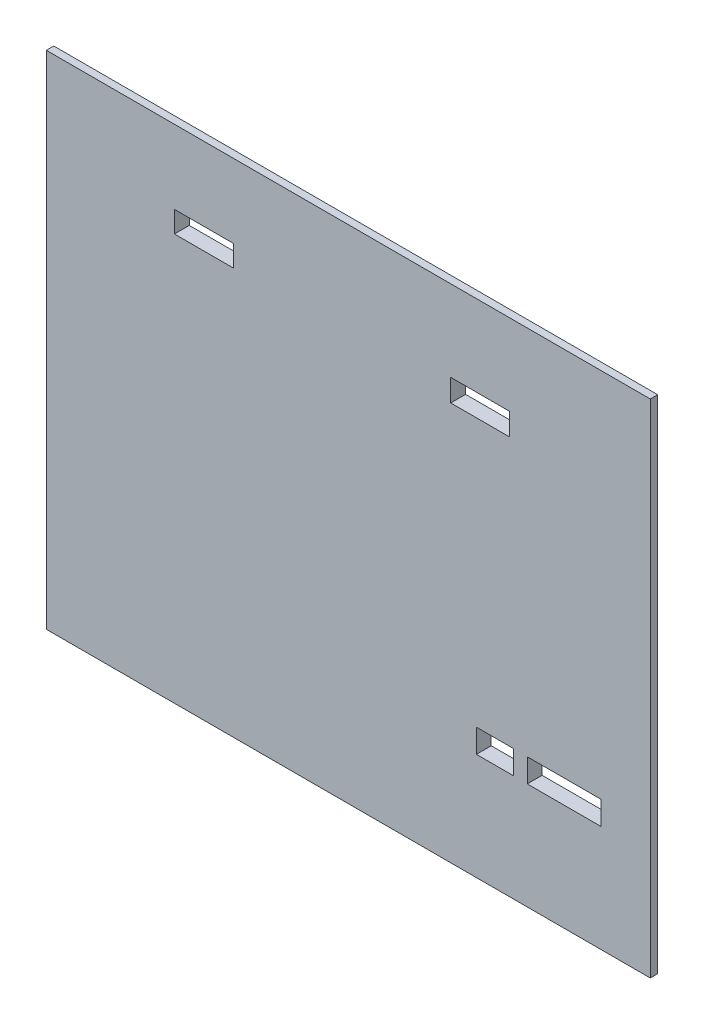
ISO-10303-21;
HEADER;
FILE_DESCRIPTION(('STEP AP214'),'2;1');
FILE_NAME('part.step','',(''),(''),'','','');
FILE_SCHEMA(('AUTOMOTIVE_DESIGN { 1 0 10303 214 1 1 1 1 }'));
ENDSEC;
DATA;
#1=APPLICATION_CONTEXT('core data for automotive mechanical design processes');
#2=APPLICATION_PROTOCOL_DEFINITION('international standard','automotive_design',2000,#1);
#3=PRODUCT_CONTEXT('',#1,'mechanical');
#4=PRODUCT('Part','Part','',(#3));
#5=PRODUCT_RELATED_PRODUCT_CATEGORY('part','',(#4));
#6=PRODUCT_DEFINITION_FORMATION('','',#4);
#7=PRODUCT_DEFINITION_CONTEXT('part definition',#1,'design');
#8=PRODUCT_DEFINITION('design','',#6,#7);
#9=PRODUCT_DEFINITION_SHAPE('','',#8);
#10=(LENGTH_UNIT() NAMED_UNIT(*) SI_UNIT(.MILLI.,.METRE.));
#11=(NAMED_UNIT(*) PLANE_ANGLE_UNIT() SI_UNIT($,.RADIAN.));
#12=(NAMED_UNIT(*) SI_UNIT($,.STERADIAN.) SOLID_ANGLE_UNIT());
#13=UNCERTAINTY_MEASURE_WITH_UNIT(LENGTH_MEASURE(1.E-05),#10,'distance_accuracy_value','');
#14=(GEOMETRIC_REPRESENTATION_CONTEXT(3) GLOBAL_UNCERTAINTY_ASSIGNED_CONTEXT((#13)) GLOBAL_UNIT_ASSIGNED_CONTEXT((#10,
#11,#12)) REPRESENTATION_CONTEXT('',''));
#15=CARTESIAN_POINT('',(0.,0.,0.));
#16=DIRECTION('',(0.,0.,1.));
#17=DIRECTION('',(1.,0.,0.));
#18=AXIS2_PLACEMENT_3D('',#15,#16,#17);
#19=CARTESIAN_POINT('',(190.5,-31.5,3.));
#20=DIRECTION('',(-1.,0.,0.));
#21=DIRECTION('',(0.,0.,1.));
#22=AXIS2_PLACEMENT_3D('',#19,#20,#21);
#23=PLANE('',#22);
#24=DIRECTION('',(0.,-1.,0.));
#25=VECTOR('',#24,1.);
#26=CARTESIAN_POINT('',(190.5,-132.8,1.5));
#27=LINE('',#26,#25);
#28=CARTESIAN_POINT('',(190.5,-31.5,1.5));
#29=VERTEX_POINT('',#28);
#30=CARTESIAN_POINT('',(190.5,-132.8,1.5));
#31=VERTEX_POINT('',#30);
#32=EDGE_CURVE('E349',#29,#31,#27,.T.);
#33=ORIENTED_EDGE('',*,*,#32,.F.);
#34=DIRECTION('',(0.,0.,-1.));
#35=VECTOR('',#34,1.);
#36=CARTESIAN_POINT('',(190.5,-31.5,3.));
#37=LINE('',#36,#35);
#38=CARTESIAN_POINT('',(190.5,-31.5,3.));
#39=VERTEX_POINT('',#38);
#40=EDGE_CURVE('E391',#39,#29,#37,.T.);
#41=ORIENTED_EDGE('',*,*,#40,.F.);
#42=DIRECTION('',(0.,1.,0.));
#43=VECTOR('',#42,1.);
#44=CARTESIAN_POINT('',(190.5,-31.5,3.));
#45=LINE('',#44,#43);
#46=CARTESIAN_POINT('',(190.5,-132.8,3.));
#47=VERTEX_POINT('',#46);
#48=EDGE_CURVE('E366',#47,#39,#45,.T.);
#49=ORIENTED_EDGE('',*,*,#48,.F.);
#50=DIRECTION('',(0.,0.,-1.));
#51=VECTOR('',#50,1.);
#52=CARTESIAN_POINT('',(190.5,-132.8,3.));
#53=LINE('',#52,#51);
#54=EDGE_CURVE('E379',#47,#31,#53,.T.);
#55=ORIENTED_EDGE('',*,*,#54,.T.);
#56=EDGE_LOOP('',(#33,#41,#49,#55));
#57=FACE_BOUND('',#56,.T.);
#58=ADVANCED_FACE('F43',(#57),#23,.F.);
#59=CARTESIAN_POINT('',(190.5,-31.5,3.));
#60=DIRECTION('',(0.,-1.,0.));
#61=DIRECTION('',(0.,0.,-1.));
#62=AXIS2_PLACEMENT_3D('',#59,#60,#61);
#63=PLANE('',#62);
#64=ORIENTED_EDGE('',*,*,#40,.T.);
#65=DIRECTION('',(1.,0.,0.));
#66=VECTOR('',#65,1.);
#67=CARTESIAN_POINT('',(67.5,-31.5,1.5));
#68=LINE('',#67,#66);
#69=CARTESIAN_POINT('',(68.5,-31.5,1.5));
#70=VERTEX_POINT('',#69);
#71=EDGE_CURVE('E344',#70,#29,#68,.T.);
#72=ORIENTED_EDGE('',*,*,#71,.F.);
#73=DIRECTION('',(0.,0.,-1.));
#74=VECTOR('',#73,1.);
#75=CARTESIAN_POINT('',(68.5,-31.5,3.));
#76=LINE('',#75,#74);
#77=CARTESIAN_POINT('',(68.5,-31.5,3.));
#78=VERTEX_POINT('',#77);
#79=EDGE_CURVE('E387',#78,#70,#76,.T.);
#80=ORIENTED_EDGE('',*,*,#79,.F.);
#81=DIRECTION('',(-1.,0.,0.));
#82=VECTOR('',#81,1.);
#83=CARTESIAN_POINT('',(190.5,-31.5,3.));
#84=LINE('',#83,#82);
#85=EDGE_CURVE('E370',#39,#78,#84,.T.);
#86=ORIENTED_EDGE('',*,*,#85,.F.);
#87=EDGE_LOOP('',(#64,#72,#80,#86));
#88=FACE_BOUND('',#87,.T.);
#89=ADVANCED_FACE('F478',(#88),#63,.F.);
#90=CARTESIAN_POINT('',(68.5,-31.5,3.));
#91=DIRECTION('',(1.,0.,0.));
#92=DIRECTION('',(0.,0.,-1.));
#93=AXIS2_PLACEMENT_3D('',#90,#91,#92);
#94=PLANE('',#93);
#95=ORIENTED_EDGE('',*,*,#79,.T.);
#96=DIRECTION('',(0.,-1.,0.));
#97=VECTOR('',#96,1.);
#98=CARTESIAN_POINT('',(68.5,-31.5,1.5));
#99=LINE('',#98,#97);
#100=CARTESIAN_POINT('',(68.5,-132.8,1.5));
#101=VERTEX_POINT('',#100);
#102=EDGE_CURVE('E359',#70,#101,#99,.T.);
#103=ORIENTED_EDGE('',*,*,#102,.T.);
#104=DIRECTION('',(0.,0.,-1.));
#105=VECTOR('',#104,1.);
#106=CARTESIAN_POINT('',(68.5,-132.8,3.));
#107=LINE('',#106,#105);
#108=CARTESIAN_POINT('',(68.5,-132.8,3.));
#109=VERTEX_POINT('',#108);
#110=EDGE_CURVE('E383',#109,#101,#107,.T.);
#111=ORIENTED_EDGE('',*,*,#110,.F.);
#112=DIRECTION('',(0.,-1.,0.));
#113=VECTOR('',#112,1.);
#114=CARTESIAN_POINT('',(68.5,-31.5,3.));
#115=LINE('',#114,#113);
#116=EDGE_CURVE('E373',#78,#109,#115,.T.);
#117=ORIENTED_EDGE('',*,*,#116,.F.);
#118=EDGE_LOOP('',(#95,#103,#111,#117));
#119=FACE_BOUND('',#118,.T.);
#120=ADVANCED_FACE('F483',(#119),#94,.F.);
#121=CARTESIAN_POINT('',(190.5,-132.8,3.));
#122=DIRECTION('',(0.,1.,0.));
#123=DIRECTION('',(0.,0.,1.));
#124=AXIS2_PLACEMENT_3D('',#121,#122,#123);
#125=PLANE('',#124);
#126=ORIENTED_EDGE('',*,*,#110,.T.);
#127=DIRECTION('',(1.,0.,0.));
#128=VECTOR('',#127,1.);
#129=CARTESIAN_POINT('',(60.5,-132.8,1.5));
#130=LINE('',#129,#128);
#131=EDGE_CURVE('E356',#101,#31,#130,.T.);
#132=ORIENTED_EDGE('',*,*,#131,.T.);
#133=ORIENTED_EDGE('',*,*,#54,.F.);
#134=DIRECTION('',(1.,0.,0.));
#135=VECTOR('',#134,1.);
#136=CARTESIAN_POINT('',(190.5,-132.8,3.));
#137=LINE('',#136,#135);
#138=EDGE_CURVE('E376',#109,#47,#137,.T.);
#139=ORIENTED_EDGE('',*,*,#138,.F.);
#140=EDGE_LOOP('',(#126,#132,#133,#139));
#141=FACE_BOUND('',#140,.T.);
#142=ADVANCED_FACE('F497',(#141),#125,.F.);
#143=CARTESIAN_POINT('',(0.,0.,3.));
#144=DIRECTION('',(0.,0.,-1.));
#145=DIRECTION('',(-1.,0.,0.));
#146=AXIS2_PLACEMENT_3D('',#143,#144,#145);
#147=PLANE('',#146);
#148=DIRECTION('',(1.,0.,0.));
#149=VECTOR('',#148,1.);
#150=CARTESIAN_POINT('',(165.654429089773,-111.265808016146,3.));
#151=LINE('',#150,#149);
#152=CARTESIAN_POINT('',(165.654429089773,-111.265808016146,3.));
#153=VERTEX_POINT('',#152);
#154=CARTESIAN_POINT('',(180.593826855843,-111.265808016146,3.));
#155=VERTEX_POINT('',#154);
#156=EDGE_CURVE('E216',#153,#155,#151,.T.);
#157=ORIENTED_EDGE('',*,*,#156,.F.);
#158=DIRECTION('',(0.,-1.,0.));
#159=VECTOR('',#158,1.);
#160=CARTESIAN_POINT('',(165.654429089773,-106.512363272397,3.));
#161=LINE('',#160,#159);
#162=CARTESIAN_POINT('',(165.654429089773,-106.512363272397,3.));
#163=VERTEX_POINT('',#162);
#164=EDGE_CURVE('E58',#163,#153,#161,.T.);
#165=ORIENTED_EDGE('',*,*,#164,.F.);
#166=DIRECTION('',(-1.,0.,0.));
#167=VECTOR('',#166,1.);
#168=CARTESIAN_POINT('',(165.654429089773,-106.512363272397,3.));
#169=LINE('',#168,#167);
#170=CARTESIAN_POINT('',(180.593826855843,-106.512363272397,3.));
#171=VERTEX_POINT('',#170);
#172=EDGE_CURVE('E224',#171,#163,#169,.T.);
#173=ORIENTED_EDGE('',*,*,#172,.F.);
#174=DIRECTION('',(0.,1.,0.));
#175=VECTOR('',#174,1.);
#176=CARTESIAN_POINT('',(180.593826855843,-106.512363272397,3.));
#177=LINE('',#176,#175);
#178=EDGE_CURVE('E206',#155,#171,#177,.T.);
#179=ORIENTED_EDGE('',*,*,#178,.F.);
#180=EDGE_LOOP('',(#157,#165,#173,#179));
#181=FACE_BOUND('',#180,.T.);
#182=DIRECTION('',(1.,0.,0.));
#183=VECTOR('',#182,1.);
#184=CARTESIAN_POINT('',(94.3773585909965,-50.7000848894199,3.));
#185=LINE('',#184,#183);
#186=CARTESIAN_POINT('',(94.3773585909965,-50.7000848894199,3.));
#187=VERTEX_POINT('',#186);
#188=CARTESIAN_POINT('',(106.288680200082,-50.7000848894199,3.));
#189=VERTEX_POINT('',#188);
#190=EDGE_CURVE('E241',#187,#189,#185,.T.);
#191=ORIENTED_EDGE('',*,*,#190,.F.);
#192=DIRECTION('',(0.,-1.,0.));
#193=VECTOR('',#192,1.);
#194=CARTESIAN_POINT('',(94.3773585909965,-46.3919767184143,3.));
#195=LINE('',#194,#193);
#196=CARTESIAN_POINT('',(94.3773585909965,-46.3919767184143,3.));
#197=VERTEX_POINT('',#196);
#198=EDGE_CURVE('E234',#197,#187,#195,.T.);
#199=ORIENTED_EDGE('',*,*,#198,.F.);
#200=DIRECTION('',(-1.,0.,0.));
#201=VECTOR('',#200,1.);
#202=CARTESIAN_POINT('',(94.3773585909965,-46.3919767184143,3.));
#203=LINE('',#202,#201);
#204=CARTESIAN_POINT('',(106.288680200082,-46.3919767184143,3.));
#205=VERTEX_POINT('',#204);
#206=EDGE_CURVE('E249',#205,#197,#203,.T.);
#207=ORIENTED_EDGE('',*,*,#206,.F.);
#208=DIRECTION('',(0.,1.,0.));
#209=VECTOR('',#208,1.);
#210=CARTESIAN_POINT('',(106.288680200082,-46.3919767184143,3.));
#211=LINE('',#210,#209);
#212=EDGE_CURVE('E245',#189,#205,#211,.T.);
#213=ORIENTED_EDGE('',*,*,#212,.F.);
#214=EDGE_LOOP('',(#191,#199,#207,#213));
#215=FACE_BOUND('',#214,.T.);
#216=DIRECTION('',(1.,0.,0.));
#217=VECTOR('',#216,1.);
#218=CARTESIAN_POINT('',(150.194380870783,-52.3497327217222,3.));
#219=LINE('',#218,#217);
#220=CARTESIAN_POINT('',(150.194380870783,-52.3497327217222,3.));
#221=VERTEX_POINT('',#220);
#222=CARTESIAN_POINT('',(162.0433402349,-52.3497327217222,3.));
#223=VERTEX_POINT('',#222);
#224=EDGE_CURVE('E269',#221,#223,#219,.T.);
#225=ORIENTED_EDGE('',*,*,#224,.F.);
#226=DIRECTION('',(0.,-1.,0.));
#227=VECTOR('',#226,1.);
#228=CARTESIAN_POINT('',(150.194380870783,-47.8734591841669,3.));
#229=LINE('',#228,#227);
#230=CARTESIAN_POINT('',(150.194380870783,-47.8734591841669,3.));
#231=VERTEX_POINT('',#230);
#232=EDGE_CURVE('E257',#231,#221,#229,.T.);
#233=ORIENTED_EDGE('',*,*,#232,.F.);
#234=DIRECTION('',(-1.,0.,0.));
#235=VECTOR('',#234,1.);
#236=CARTESIAN_POINT('',(150.194380870783,-47.8734591841669,3.));
#237=LINE('',#236,#235);
#238=CARTESIAN_POINT('',(162.0433402349,-47.8734591841669,3.));
#239=VERTEX_POINT('',#238);
#240=EDGE_CURVE('E277',#239,#231,#237,.T.);
#241=ORIENTED_EDGE('',*,*,#240,.F.);
#242=DIRECTION('',(0.,1.,0.));
#243=VECTOR('',#242,1.);
#244=CARTESIAN_POINT('',(162.0433402349,-47.8734591841669,3.));
#245=LINE('',#244,#243);
#246=EDGE_CURVE('E273',#223,#239,#245,.T.);
#247=ORIENTED_EDGE('',*,*,#246,.F.);
#248=EDGE_LOOP('',(#225,#233,#241,#247));
#249=FACE_BOUND('',#248,.T.);
#250=DIRECTION('',(-1.,0.,0.));
#251=VECTOR('',#250,1.);
#252=CARTESIAN_POINT('',(162.875,-106.474249894409,3.));
#253=LINE('',#252,#251);
#254=CARTESIAN_POINT('',(162.875,-106.474249894409,3.));
#255=VERTEX_POINT('',#254);
#256=CARTESIAN_POINT('',(155.377227812848,-106.474249894409,3.));
#257=VERTEX_POINT('',#256);
#258=EDGE_CURVE('E297',#255,#257,#253,.T.);
#259=ORIENTED_EDGE('',*,*,#258,.F.);
#260=DIRECTION('',(0.,1.,0.));
#261=VECTOR('',#260,1.);
#262=CARTESIAN_POINT('',(162.875,-111.233730758469,3.));
#263=LINE('',#262,#261);
#264=CARTESIAN_POINT('',(162.875,-111.233730758469,3.));
#265=VERTEX_POINT('',#264);
#266=EDGE_CURVE('E285',#265,#255,#263,.T.);
#267=ORIENTED_EDGE('',*,*,#266,.F.);
#268=DIRECTION('',(1.,0.,0.));
#269=VECTOR('',#268,1.);
#270=CARTESIAN_POINT('',(162.875,-111.233730758469,3.));
#271=LINE('',#270,#269);
#272=CARTESIAN_POINT('',(155.377227812848,-111.233730758469,3.));
#273=VERTEX_POINT('',#272);
#274=EDGE_CURVE('E305',#273,#265,#271,.T.);
#275=ORIENTED_EDGE('',*,*,#274,.F.);
#276=DIRECTION('',(0.,-1.,0.));
#277=VECTOR('',#276,1.);
#278=CARTESIAN_POINT('',(155.377227812848,-111.233730758469,3.));
#279=LINE('',#278,#277);
#280=EDGE_CURVE('E301',#257,#273,#279,.T.);
#281=ORIENTED_EDGE('',*,*,#280,.F.);
#282=EDGE_LOOP('',(#259,#267,#275,#281));
#283=FACE_BOUND('',#282,.T.);
#284=ORIENTED_EDGE('',*,*,#48,.T.);
#285=ORIENTED_EDGE('',*,*,#85,.T.);
#286=ORIENTED_EDGE('',*,*,#116,.T.);
#287=ORIENTED_EDGE('',*,*,#138,.T.);
#288=EDGE_LOOP('',(#284,#285,#286,#287));
#289=FACE_BOUND('',#288,.T.);
#290=ADVANCED_FACE('F221',(#181,#215,#249,#283,#289),#147,.F.);
#291=CARTESIAN_POINT('',(0.,0.,0.));
#292=DIRECTION('',(0.,0.,-1.));
#293=DIRECTION('',(-1.,0.,0.));
#294=AXIS2_PLACEMENT_3D('',#291,#292,#293);
#295=PLANE('',#294);
#296=DIRECTION('',(0.,1.,0.));
#297=VECTOR('',#296,1.);
#298=CARTESIAN_POINT('',(165.654429089773,0.,0.));
#299=LINE('',#298,#297);
#300=CARTESIAN_POINT('',(165.654429089773,-111.265808016146,0.));
#301=VERTEX_POINT('',#300);
#302=CARTESIAN_POINT('',(165.654429089773,-106.512363272397,0.));
#303=VERTEX_POINT('',#302);
#304=EDGE_CURVE('E11',#301,#303,#299,.T.);
#305=ORIENTED_EDGE('',*,*,#304,.F.);
#306=DIRECTION('',(-1.,0.,0.));
#307=VECTOR('',#306,1.);
#308=CARTESIAN_POINT('',(0.,-111.265808016146,0.));
#309=LINE('',#308,#307);
#310=CARTESIAN_POINT('',(180.593826855843,-111.265808016146,0.));
#311=VERTEX_POINT('',#310);
#312=EDGE_CURVE('E449',#311,#301,#309,.T.);
#313=ORIENTED_EDGE('',*,*,#312,.F.);
#314=DIRECTION('',(0.,-1.,0.));
#315=VECTOR('',#314,1.);
#316=CARTESIAN_POINT('',(180.593826855843,0.,0.));
#317=LINE('',#316,#315);
#318=CARTESIAN_POINT('',(180.593826855843,-106.512363272397,0.));
#319=VERTEX_POINT('',#318);
#320=EDGE_CURVE('E209',#319,#311,#317,.T.);
#321=ORIENTED_EDGE('',*,*,#320,.F.);
#322=DIRECTION('',(1.,0.,0.));
#323=VECTOR('',#322,1.);
#324=CARTESIAN_POINT('',(0.,-106.512363272397,0.));
#325=LINE('',#324,#323);
#326=EDGE_CURVE('E51',#303,#319,#325,.T.);
#327=ORIENTED_EDGE('',*,*,#326,.F.);
#328=EDGE_LOOP('',(#305,#313,#321,#327));
#329=FACE_BOUND('',#328,.T.);
#330=DIRECTION('',(0.,1.,0.));
#331=VECTOR('',#330,1.);
#332=CARTESIAN_POINT('',(94.3773585909965,0.,0.));
#333=LINE('',#332,#331);
#334=CARTESIAN_POINT('',(94.3773585909965,-50.7000848894199,0.));
#335=VERTEX_POINT('',#334);
#336=CARTESIAN_POINT('',(94.3773585909965,-46.3919767184143,0.));
#337=VERTEX_POINT('',#336);
#338=EDGE_CURVE('E446',#335,#337,#333,.T.);
#339=ORIENTED_EDGE('',*,*,#338,.F.);
#340=DIRECTION('',(-1.,0.,0.));
#341=VECTOR('',#340,1.);
#342=CARTESIAN_POINT('',(0.,-50.7000848894199,0.));
#343=LINE('',#342,#341);
#344=CARTESIAN_POINT('',(106.288680200082,-50.7000848894199,0.));
#345=VERTEX_POINT('',#344);
#346=EDGE_CURVE('E436',#345,#335,#343,.T.);
#347=ORIENTED_EDGE('',*,*,#346,.F.);
#348=DIRECTION('',(0.,-1.,0.));
#349=VECTOR('',#348,1.);
#350=CARTESIAN_POINT('',(106.288680200082,0.,0.));
#351=LINE('',#350,#349);
#352=CARTESIAN_POINT('',(106.288680200082,-46.3919767184143,0.));
#353=VERTEX_POINT('',#352);
#354=EDGE_CURVE('E439',#353,#345,#351,.T.);
#355=ORIENTED_EDGE('',*,*,#354,.F.);
#356=DIRECTION('',(1.,0.,0.));
#357=VECTOR('',#356,1.);
#358=CARTESIAN_POINT('',(0.,-46.3919767184143,0.));
#359=LINE('',#358,#357);
#360=EDGE_CURVE('E443',#337,#353,#359,.T.);
#361=ORIENTED_EDGE('',*,*,#360,.F.);
#362=EDGE_LOOP('',(#339,#347,#355,#361));
#363=FACE_BOUND('',#362,.T.);
#364=DIRECTION('',(0.,1.,0.));
#365=VECTOR('',#364,1.);
#366=CARTESIAN_POINT('',(150.194380870783,0.,0.));
#367=LINE('',#366,#365);
#368=CARTESIAN_POINT('',(150.194380870783,-52.3497327217222,0.));
#369=VERTEX_POINT('',#368);
#370=CARTESIAN_POINT('',(150.194380870783,-47.8734591841669,0.));
#371=VERTEX_POINT('',#370);
#372=EDGE_CURVE('E433',#369,#371,#367,.T.);
#373=ORIENTED_EDGE('',*,*,#372,.F.);
#374=DIRECTION('',(-1.,0.,0.));
#375=VECTOR('',#374,1.);
#376=CARTESIAN_POINT('',(0.,-52.3497327217222,0.));
#377=LINE('',#376,#375);
#378=CARTESIAN_POINT('',(162.0433402349,-52.3497327217222,0.));
#379=VERTEX_POINT('',#378);
#380=EDGE_CURVE('E423',#379,#369,#377,.T.);
#381=ORIENTED_EDGE('',*,*,#380,.F.);
#382=DIRECTION('',(0.,-1.,0.));
#383=VECTOR('',#382,1.);
#384=CARTESIAN_POINT('',(162.0433402349,0.,0.));
#385=LINE('',#384,#383);
#386=CARTESIAN_POINT('',(162.0433402349,-47.8734591841669,0.));
#387=VERTEX_POINT('',#386);
#388=EDGE_CURVE('E426',#387,#379,#385,.T.);
#389=ORIENTED_EDGE('',*,*,#388,.F.);
#390=DIRECTION('',(1.,0.,0.));
#391=VECTOR('',#390,1.);
#392=CARTESIAN_POINT('',(0.,-47.8734591841669,0.));
#393=LINE('',#392,#391);
#394=EDGE_CURVE('E430',#371,#387,#393,.T.);
#395=ORIENTED_EDGE('',*,*,#394,.F.);
#396=EDGE_LOOP('',(#373,#381,#389,#395));
#397=FACE_BOUND('',#396,.T.);
#398=DIRECTION('',(0.,-1.,0.));
#399=VECTOR('',#398,1.);
#400=CARTESIAN_POINT('',(162.875,0.,0.));
#401=LINE('',#400,#399);
#402=CARTESIAN_POINT('',(162.875,-106.474249894409,0.));
#403=VERTEX_POINT('',#402);
#404=CARTESIAN_POINT('',(162.875,-111.233730758469,0.));
#405=VERTEX_POINT('',#404);
#406=EDGE_CURVE('E420',#403,#405,#401,.T.);
#407=ORIENTED_EDGE('',*,*,#406,.F.);
#408=DIRECTION('',(1.,0.,0.));
#409=VECTOR('',#408,1.);
#410=CARTESIAN_POINT('',(0.,-106.474249894409,0.));
#411=LINE('',#410,#409);
#412=CARTESIAN_POINT('',(155.377227812848,-106.474249894409,0.));
#413=VERTEX_POINT('',#412);
#414=EDGE_CURVE('E410',#413,#403,#411,.T.);
#415=ORIENTED_EDGE('',*,*,#414,.F.);
#416=DIRECTION('',(0.,1.,0.));
#417=VECTOR('',#416,1.);
#418=CARTESIAN_POINT('',(155.377227812848,0.,0.));
#419=LINE('',#418,#417);
#420=CARTESIAN_POINT('',(155.377227812848,-111.233730758469,0.));
#421=VERTEX_POINT('',#420);
#422=EDGE_CURVE('E413',#421,#413,#419,.T.);
#423=ORIENTED_EDGE('',*,*,#422,.F.);
#424=DIRECTION('',(-1.,0.,0.));
#425=VECTOR('',#424,1.);
#426=CARTESIAN_POINT('',(0.,-111.233730758469,0.));
#427=LINE('',#426,#425);
#428=EDGE_CURVE('E417',#405,#421,#427,.T.);
#429=ORIENTED_EDGE('',*,*,#428,.F.);
#430=EDGE_LOOP('',(#407,#415,#423,#429));
#431=FACE_BOUND('',#430,.T.);
#432=DIRECTION('',(0.,1.,0.));
#433=VECTOR('',#432,1.);
#434=CARTESIAN_POINT('',(188.4,-154.5,0.));
#435=LINE('',#434,#433);
#436=CARTESIAN_POINT('',(188.4,-130.7,0.));
#437=VERTEX_POINT('',#436);
#438=CARTESIAN_POINT('',(188.4,-33.6,0.));
#439=VERTEX_POINT('',#438);
#440=EDGE_CURVE('E313',#437,#439,#435,.T.);
#441=ORIENTED_EDGE('',*,*,#440,.F.);
#442=DIRECTION('',(1.,0.,0.));
#443=VECTOR('',#442,1.);
#444=CARTESIAN_POINT('',(0.,-130.7,0.));
#445=LINE('',#444,#443);
#446=CARTESIAN_POINT('',(70.6,-130.7,0.));
#447=VERTEX_POINT('',#446);
#448=EDGE_CURVE('E395',#447,#437,#445,.T.);
#449=ORIENTED_EDGE('',*,*,#448,.F.);
#450=DIRECTION('',(0.,1.,0.));
#451=VECTOR('',#450,1.);
#452=CARTESIAN_POINT('',(70.6,-154.5,0.));
#453=LINE('',#452,#451);
#454=CARTESIAN_POINT('',(70.6,-33.6,0.));
#455=VERTEX_POINT('',#454);
#456=EDGE_CURVE('E334',#447,#455,#453,.T.);
#457=ORIENTED_EDGE('',*,*,#456,.T.);
#458=DIRECTION('',(-1.,0.,0.));
#459=VECTOR('',#458,1.);
#460=CARTESIAN_POINT('',(0.,-33.6,0.));
#461=LINE('',#460,#459);
#462=EDGE_CURVE('E399',#439,#455,#461,.T.);
#463=ORIENTED_EDGE('',*,*,#462,.F.);
#464=EDGE_LOOP('',(#441,#449,#457,#463));
#465=FACE_BOUND('',#464,.T.);
#466=ADVANCED_FACE('F460',(#329,#363,#397,#431,#465),#295,.T.);
#467=CARTESIAN_POINT('',(60.5,-132.8,1.5));
#468=DIRECTION('',(0.,0.,1.));
#469=DIRECTION('',(1.,0.,0.));
#470=AXIS2_PLACEMENT_3D('',#467,#468,#469);
#471=PLANE('',#470);
#472=DIRECTION('',(0.,1.,0.));
#473=VECTOR('',#472,1.);
#474=CARTESIAN_POINT('',(188.4,-154.5,1.5));
#475=LINE('',#474,#473);
#476=CARTESIAN_POINT('',(188.4,-130.7,1.5));
#477=VERTEX_POINT('',#476);
#478=CARTESIAN_POINT('',(188.4,-33.6,1.5));
#479=VERTEX_POINT('',#478);
#480=EDGE_CURVE('E323',#477,#479,#475,.T.);
#481=ORIENTED_EDGE('',*,*,#480,.T.);
#482=DIRECTION('',(1.,0.,0.));
#483=VECTOR('',#482,1.);
#484=CARTESIAN_POINT('',(67.5,-33.6,1.5));
#485=LINE('',#484,#483);
#486=CARTESIAN_POINT('',(70.6,-33.6,1.5));
#487=VERTEX_POINT('',#486);
#488=EDGE_CURVE('E345',#487,#479,#485,.T.);
#489=ORIENTED_EDGE('',*,*,#488,.F.);
#490=DIRECTION('',(0.,1.,0.));
#491=VECTOR('',#490,1.);
#492=CARTESIAN_POINT('',(70.6,-154.5,1.5));
#493=LINE('',#492,#491);
#494=CARTESIAN_POINT('',(70.6,-130.7,1.5));
#495=VERTEX_POINT('',#494);
#496=EDGE_CURVE('E333',#495,#487,#493,.T.);
#497=ORIENTED_EDGE('',*,*,#496,.F.);
#498=DIRECTION('',(1.,0.,0.));
#499=VECTOR('',#498,1.);
#500=CARTESIAN_POINT('',(60.5,-130.7,1.5));
#501=LINE('',#500,#499);
#502=EDGE_CURVE('E355',#495,#477,#501,.T.);
#503=ORIENTED_EDGE('',*,*,#502,.T.);
#504=EDGE_LOOP('',(#481,#489,#497,#503));
#505=FACE_BOUND('',#504,.T.);
#506=ORIENTED_EDGE('',*,*,#71,.T.);
#507=ORIENTED_EDGE('',*,*,#32,.T.);
#508=ORIENTED_EDGE('',*,*,#131,.F.);
#509=ORIENTED_EDGE('',*,*,#102,.F.);
#510=EDGE_LOOP('',(#506,#507,#508,#509));
#511=FACE_BOUND('',#510,.T.);
#512=ADVANCED_FACE('F498',(#505,#511),#471,.F.);
#513=CARTESIAN_POINT('',(60.5,-130.7,0.));
#514=DIRECTION('',(0.,1.,0.));
#515=DIRECTION('',(0.,0.,1.));
#516=AXIS2_PLACEMENT_3D('',#513,#514,#515);
#517=PLANE('',#516);
#518=ORIENTED_EDGE('',*,*,#448,.T.);
#519=DIRECTION('',(0.,0.,1.));
#520=VECTOR('',#519,1.);
#521=CARTESIAN_POINT('',(188.4,-130.7,0.));
#522=LINE('',#521,#520);
#523=EDGE_CURVE('E327',#437,#477,#522,.T.);
#524=ORIENTED_EDGE('',*,*,#523,.T.);
#525=ORIENTED_EDGE('',*,*,#502,.F.);
#526=DIRECTION('',(0.,0.,-1.));
#527=VECTOR('',#526,1.);
#528=CARTESIAN_POINT('',(70.6,-130.7,0.));
#529=LINE('',#528,#527);
#530=EDGE_CURVE('E338',#495,#447,#529,.T.);
#531=ORIENTED_EDGE('',*,*,#530,.T.);
#532=EDGE_LOOP('',(#518,#524,#525,#531));
#533=FACE_BOUND('',#532,.T.);
#534=ADVANCED_FACE('F511',(#533),#517,.F.);
#535=CARTESIAN_POINT('',(67.5,-33.6,0.));
#536=DIRECTION('',(0.,-1.,0.));
#537=DIRECTION('',(0.,0.,-1.));
#538=AXIS2_PLACEMENT_3D('',#535,#536,#537);
#539=PLANE('',#538);
#540=ORIENTED_EDGE('',*,*,#488,.T.);
#541=DIRECTION('',(0.,0.,-1.));
#542=VECTOR('',#541,1.);
#543=CARTESIAN_POINT('',(188.4,-33.6,0.));
#544=LINE('',#543,#542);
#545=EDGE_CURVE('E406',#479,#439,#544,.T.);
#546=ORIENTED_EDGE('',*,*,#545,.T.);
#547=ORIENTED_EDGE('',*,*,#462,.T.);
#548=DIRECTION('',(0.,0.,1.));
#549=VECTOR('',#548,1.);
#550=CARTESIAN_POINT('',(70.6,-33.6,0.));
#551=LINE('',#550,#549);
#552=EDGE_CURVE('E402',#455,#487,#551,.T.);
#553=ORIENTED_EDGE('',*,*,#552,.T.);
#554=EDGE_LOOP('',(#540,#546,#547,#553));
#555=FACE_BOUND('',#554,.T.);
#556=ADVANCED_FACE('F514',(#555),#539,.F.);
#557=CARTESIAN_POINT('',(70.6,-154.5,0.));
#558=DIRECTION('',(1.,0.,0.));
#559=DIRECTION('',(0.,0.,-1.));
#560=AXIS2_PLACEMENT_3D('',#557,#558,#559);
#561=PLANE('',#560);
#562=ORIENTED_EDGE('',*,*,#496,.T.);
#563=ORIENTED_EDGE('',*,*,#552,.F.);
#564=ORIENTED_EDGE('',*,*,#456,.F.);
#565=ORIENTED_EDGE('',*,*,#530,.F.);
#566=EDGE_LOOP('',(#562,#563,#564,#565));
#567=FACE_BOUND('',#566,.T.);
#568=ADVANCED_FACE('F521',(#567),#561,.F.);
#569=CARTESIAN_POINT('',(188.4,-154.5,0.));
#570=DIRECTION('',(-1.,0.,0.));
#571=DIRECTION('',(0.,0.,1.));
#572=AXIS2_PLACEMENT_3D('',#569,#570,#571);
#573=PLANE('',#572);
#574=ORIENTED_EDGE('',*,*,#440,.T.);
#575=ORIENTED_EDGE('',*,*,#545,.F.);
#576=ORIENTED_EDGE('',*,*,#480,.F.);
#577=ORIENTED_EDGE('',*,*,#523,.F.);
#578=EDGE_LOOP('',(#574,#575,#576,#577));
#579=FACE_BOUND('',#578,.T.);
#580=ADVANCED_FACE('F525',(#579),#573,.F.);
#581=CARTESIAN_POINT('',(162.875,-111.233730758469,-2.));
#582=DIRECTION('',(1.,0.,0.));
#583=DIRECTION('',(0.,0.,-1.));
#584=AXIS2_PLACEMENT_3D('',#581,#582,#583);
#585=PLANE('',#584);
#586=ORIENTED_EDGE('',*,*,#406,.T.);
#587=DIRECTION('',(0.,0.,1.));
#588=VECTOR('',#587,1.);
#589=CARTESIAN_POINT('',(162.875,-111.233730758469,-2.));
#590=LINE('',#589,#588);
#591=EDGE_CURVE('E310',#405,#265,#590,.T.);
#592=ORIENTED_EDGE('',*,*,#591,.T.);
#593=ORIENTED_EDGE('',*,*,#266,.T.);
#594=DIRECTION('',(0.,0.,1.));
#595=VECTOR('',#594,1.);
#596=CARTESIAN_POINT('',(162.875,-106.474249894409,-2.));
#597=LINE('',#596,#595);
#598=EDGE_CURVE('E309',#403,#255,#597,.T.);
#599=ORIENTED_EDGE('',*,*,#598,.F.);
#600=EDGE_LOOP('',(#586,#592,#593,#599));
#601=FACE_BOUND('',#600,.T.);
#602=ADVANCED_FACE('F529',(#601),#585,.F.);
#603=CARTESIAN_POINT('',(162.875,-111.233730758469,-2.));
#604=DIRECTION('',(0.,-1.,0.));
#605=DIRECTION('',(0.,0.,-1.));
#606=AXIS2_PLACEMENT_3D('',#603,#604,#605);
#607=PLANE('',#606);
#608=ORIENTED_EDGE('',*,*,#428,.T.);
#609=DIRECTION('',(0.,0.,1.));
#610=VECTOR('',#609,1.);
#611=CARTESIAN_POINT('',(155.377227812848,-111.233730758469,-2.));
#612=LINE('',#611,#610);
#613=EDGE_CURVE('E314',#421,#273,#612,.T.);
#614=ORIENTED_EDGE('',*,*,#613,.T.);
#615=ORIENTED_EDGE('',*,*,#274,.T.);
#616=ORIENTED_EDGE('',*,*,#591,.F.);
#617=EDGE_LOOP('',(#608,#614,#615,#616));
#618=FACE_BOUND('',#617,.T.);
#619=ADVANCED_FACE('F533',(#618),#607,.F.);
#620=CARTESIAN_POINT('',(155.377227812848,-111.233730758469,-2.));
#621=DIRECTION('',(-1.,0.,0.));
#622=DIRECTION('',(0.,0.,1.));
#623=AXIS2_PLACEMENT_3D('',#620,#621,#622);
#624=PLANE('',#623);
#625=ORIENTED_EDGE('',*,*,#422,.T.);
#626=DIRECTION('',(0.,0.,1.));
#627=VECTOR('',#626,1.);
#628=CARTESIAN_POINT('',(155.377227812848,-106.474249894409,-2.));
#629=LINE('',#628,#627);
#630=EDGE_CURVE('E317',#413,#257,#629,.T.);
#631=ORIENTED_EDGE('',*,*,#630,.T.);
#632=ORIENTED_EDGE('',*,*,#280,.T.);
#633=ORIENTED_EDGE('',*,*,#613,.F.);
#634=EDGE_LOOP('',(#625,#631,#632,#633));
#635=FACE_BOUND('',#634,.T.);
#636=ADVANCED_FACE('F539',(#635),#624,.F.);
#637=CARTESIAN_POINT('',(162.875,-106.474249894409,-2.));
#638=DIRECTION('',(0.,1.,0.));
#639=DIRECTION('',(0.,0.,1.));
#640=AXIS2_PLACEMENT_3D('',#637,#638,#639);
#641=PLANE('',#640);
#642=ORIENTED_EDGE('',*,*,#414,.T.);
#643=ORIENTED_EDGE('',*,*,#598,.T.);
#644=ORIENTED_EDGE('',*,*,#258,.T.);
#645=ORIENTED_EDGE('',*,*,#630,.F.);
#646=EDGE_LOOP('',(#642,#643,#644,#645));
#647=FACE_BOUND('',#646,.T.);
#648=ADVANCED_FACE('F535',(#647),#641,.F.);
#649=CARTESIAN_POINT('',(150.194380870783,-47.8734591841669,-2.));
#650=DIRECTION('',(-1.,0.,0.));
#651=DIRECTION('',(0.,0.,1.));
#652=AXIS2_PLACEMENT_3D('',#649,#650,#651);
#653=PLANE('',#652);
#654=ORIENTED_EDGE('',*,*,#372,.T.);
#655=DIRECTION('',(0.,0.,1.));
#656=VECTOR('',#655,1.);
#657=CARTESIAN_POINT('',(150.194380870783,-47.8734591841669,-2.));
#658=LINE('',#657,#656);
#659=EDGE_CURVE('E282',#371,#231,#658,.T.);
#660=ORIENTED_EDGE('',*,*,#659,.T.);
#661=ORIENTED_EDGE('',*,*,#232,.T.);
#662=DIRECTION('',(0.,0.,1.));
#663=VECTOR('',#662,1.);
#664=CARTESIAN_POINT('',(150.194380870783,-52.3497327217222,-2.));
#665=LINE('',#664,#663);
#666=EDGE_CURVE('E281',#369,#221,#665,.T.);
#667=ORIENTED_EDGE('',*,*,#666,.F.);
#668=EDGE_LOOP('',(#654,#660,#661,#667));
#669=FACE_BOUND('',#668,.T.);
#670=ADVANCED_FACE('F538',(#669),#653,.F.);
#671=CARTESIAN_POINT('',(150.194380870783,-47.8734591841669,-2.));
#672=DIRECTION('',(0.,1.,0.));
#673=DIRECTION('',(0.,0.,1.));
#674=AXIS2_PLACEMENT_3D('',#671,#672,#673);
#675=PLANE('',#674);
#676=ORIENTED_EDGE('',*,*,#394,.T.);
#677=DIRECTION('',(0.,0.,1.));
#678=VECTOR('',#677,1.);
#679=CARTESIAN_POINT('',(162.0433402349,-47.8734591841669,-2.));
#680=LINE('',#679,#678);
#681=EDGE_CURVE('E286',#387,#239,#680,.T.);
#682=ORIENTED_EDGE('',*,*,#681,.T.);
#683=ORIENTED_EDGE('',*,*,#240,.T.);
#684=ORIENTED_EDGE('',*,*,#659,.F.);
#685=EDGE_LOOP('',(#676,#682,#683,#684));
#686=FACE_BOUND('',#685,.T.);
#687=ADVANCED_FACE('F549',(#686),#675,.F.);
#688=CARTESIAN_POINT('',(162.0433402349,-47.8734591841669,-2.));
#689=DIRECTION('',(1.,0.,0.));
#690=DIRECTION('',(0.,0.,-1.));
#691=AXIS2_PLACEMENT_3D('',#688,#689,#690);
#692=PLANE('',#691);
#693=ORIENTED_EDGE('',*,*,#388,.T.);
#694=DIRECTION('',(0.,0.,1.));
#695=VECTOR('',#694,1.);
#696=CARTESIAN_POINT('',(162.0433402349,-52.3497327217222,-2.));
#697=LINE('',#696,#695);
#698=EDGE_CURVE('E289',#379,#223,#697,.T.);
#699=ORIENTED_EDGE('',*,*,#698,.T.);
#700=ORIENTED_EDGE('',*,*,#246,.T.);
#701=ORIENTED_EDGE('',*,*,#681,.F.);
#702=EDGE_LOOP('',(#693,#699,#700,#701));
#703=FACE_BOUND('',#702,.T.);
#704=ADVANCED_FACE('F555',(#703),#692,.F.);
#705=CARTESIAN_POINT('',(150.194380870783,-52.3497327217222,-2.));
#706=DIRECTION('',(0.,-1.,0.));
#707=DIRECTION('',(0.,0.,-1.));
#708=AXIS2_PLACEMENT_3D('',#705,#706,#707);
#709=PLANE('',#708);
#710=ORIENTED_EDGE('',*,*,#380,.T.);
#711=ORIENTED_EDGE('',*,*,#666,.T.);
#712=ORIENTED_EDGE('',*,*,#224,.T.);
#713=ORIENTED_EDGE('',*,*,#698,.F.);
#714=EDGE_LOOP('',(#710,#711,#712,#713));
#715=FACE_BOUND('',#714,.T.);
#716=ADVANCED_FACE('F551',(#715),#709,.F.);
#717=CARTESIAN_POINT('',(94.3773585909965,-46.3919767184143,-2.));
#718=DIRECTION('',(-1.,0.,0.));
#719=DIRECTION('',(0.,0.,1.));
#720=AXIS2_PLACEMENT_3D('',#717,#718,#719);
#721=PLANE('',#720);
#722=ORIENTED_EDGE('',*,*,#338,.T.);
#723=DIRECTION('',(0.,0.,1.));
#724=VECTOR('',#723,1.);
#725=CARTESIAN_POINT('',(94.3773585909965,-46.3919767184143,-2.));
#726=LINE('',#725,#724);
#727=EDGE_CURVE('E254',#337,#197,#726,.T.);
#728=ORIENTED_EDGE('',*,*,#727,.T.);
#729=ORIENTED_EDGE('',*,*,#198,.T.);
#730=DIRECTION('',(0.,0.,1.));
#731=VECTOR('',#730,1.);
#732=CARTESIAN_POINT('',(94.3773585909965,-50.7000848894199,-2.));
#733=LINE('',#732,#731);
#734=EDGE_CURVE('E253',#335,#187,#733,.T.);
#735=ORIENTED_EDGE('',*,*,#734,.F.);
#736=EDGE_LOOP('',(#722,#728,#729,#735));
#737=FACE_BOUND('',#736,.T.);
#738=ADVANCED_FACE('F554',(#737),#721,.F.);
#739=CARTESIAN_POINT('',(94.3773585909965,-46.3919767184143,-2.));
#740=DIRECTION('',(0.,1.,0.));
#741=DIRECTION('',(0.,0.,1.));
#742=AXIS2_PLACEMENT_3D('',#739,#740,#741);
#743=PLANE('',#742);
#744=ORIENTED_EDGE('',*,*,#360,.T.);
#745=DIRECTION('',(0.,0.,1.));
#746=VECTOR('',#745,1.);
#747=CARTESIAN_POINT('',(106.288680200082,-46.3919767184143,-2.));
#748=LINE('',#747,#746);
#749=EDGE_CURVE('E258',#353,#205,#748,.T.);
#750=ORIENTED_EDGE('',*,*,#749,.T.);
#751=ORIENTED_EDGE('',*,*,#206,.T.);
#752=ORIENTED_EDGE('',*,*,#727,.F.);
#753=EDGE_LOOP('',(#744,#750,#751,#752));
#754=FACE_BOUND('',#753,.T.);
#755=ADVANCED_FACE('F564',(#754),#743,.F.);
#756=CARTESIAN_POINT('',(106.288680200082,-46.3919767184143,-2.));
#757=DIRECTION('',(1.,0.,0.));
#758=DIRECTION('',(0.,0.,-1.));
#759=AXIS2_PLACEMENT_3D('',#756,#757,#758);
#760=PLANE('',#759);
#761=ORIENTED_EDGE('',*,*,#354,.T.);
#762=DIRECTION('',(0.,0.,1.));
#763=VECTOR('',#762,1.);
#764=CARTESIAN_POINT('',(106.288680200082,-50.7000848894199,-2.));
#765=LINE('',#764,#763);
#766=EDGE_CURVE('E261',#345,#189,#765,.T.);
#767=ORIENTED_EDGE('',*,*,#766,.T.);
#768=ORIENTED_EDGE('',*,*,#212,.T.);
#769=ORIENTED_EDGE('',*,*,#749,.F.);
#770=EDGE_LOOP('',(#761,#767,#768,#769));
#771=FACE_BOUND('',#770,.T.);
#772=ADVANCED_FACE('F472',(#771),#760,.F.);
#773=CARTESIAN_POINT('',(94.3773585909965,-50.7000848894199,-2.));
#774=DIRECTION('',(0.,-1.,0.));
#775=DIRECTION('',(0.,0.,-1.));
#776=AXIS2_PLACEMENT_3D('',#773,#774,#775);
#777=PLANE('',#776);
#778=ORIENTED_EDGE('',*,*,#346,.T.);
#779=ORIENTED_EDGE('',*,*,#734,.T.);
#780=ORIENTED_EDGE('',*,*,#190,.T.);
#781=ORIENTED_EDGE('',*,*,#766,.F.);
#782=EDGE_LOOP('',(#778,#779,#780,#781));
#783=FACE_BOUND('',#782,.T.);
#784=ADVANCED_FACE('F465',(#783),#777,.F.);
#785=CARTESIAN_POINT('',(165.654429089773,-106.512363272397,-2.));
#786=DIRECTION('',(-1.,0.,0.));
#787=DIRECTION('',(0.,0.,1.));
#788=AXIS2_PLACEMENT_3D('',#785,#786,#787);
#789=PLANE('',#788);
#790=ORIENTED_EDGE('',*,*,#304,.T.);
#791=DIRECTION('',(0.,0.,1.));
#792=VECTOR('',#791,1.);
#793=CARTESIAN_POINT('',(165.654429089773,-106.512363272397,-2.));
#794=LINE('',#793,#792);
#795=EDGE_CURVE('E231',#303,#163,#794,.T.);
#796=ORIENTED_EDGE('',*,*,#795,.T.);
#797=ORIENTED_EDGE('',*,*,#164,.T.);
#798=DIRECTION('',(0.,0.,1.));
#799=VECTOR('',#798,1.);
#800=CARTESIAN_POINT('',(165.654429089773,-111.265808016146,-2.));
#801=LINE('',#800,#799);
#802=EDGE_CURVE('E213',#301,#153,#801,.T.);
#803=ORIENTED_EDGE('',*,*,#802,.F.);
#804=EDGE_LOOP('',(#790,#796,#797,#803));
#805=FACE_BOUND('',#804,.T.);
#806=ADVANCED_FACE('F462',(#805),#789,.F.);
#807=CARTESIAN_POINT('',(165.654429089773,-106.512363272397,-2.));
#808=DIRECTION('',(0.,1.,0.));
#809=DIRECTION('',(0.,0.,1.));
#810=AXIS2_PLACEMENT_3D('',#807,#808,#809);
#811=PLANE('',#810);
#812=ORIENTED_EDGE('',*,*,#326,.T.);
#813=DIRECTION('',(0.,0.,1.));
#814=VECTOR('',#813,1.);
#815=CARTESIAN_POINT('',(180.593826855843,-106.512363272397,-2.));
#816=LINE('',#815,#814);
#817=EDGE_CURVE('E212',#319,#171,#816,.T.);
#818=ORIENTED_EDGE('',*,*,#817,.T.);
#819=ORIENTED_EDGE('',*,*,#172,.T.);
#820=ORIENTED_EDGE('',*,*,#795,.F.);
#821=EDGE_LOOP('',(#812,#818,#819,#820));
#822=FACE_BOUND('',#821,.T.);
#823=ADVANCED_FACE('F457',(#822),#811,.F.);
#824=CARTESIAN_POINT('',(180.593826855843,-106.512363272397,-2.));
#825=DIRECTION('',(1.,0.,0.));
#826=DIRECTION('',(0.,0.,-1.));
#827=AXIS2_PLACEMENT_3D('',#824,#825,#826);
#828=PLANE('',#827);
#829=ORIENTED_EDGE('',*,*,#320,.T.);
#830=DIRECTION('',(0.,0.,1.));
#831=VECTOR('',#830,1.);
#832=CARTESIAN_POINT('',(180.593826855843,-111.265808016146,-2.));
#833=LINE('',#832,#831);
#834=EDGE_CURVE('E66',#311,#155,#833,.T.);
#835=ORIENTED_EDGE('',*,*,#834,.T.);
#836=ORIENTED_EDGE('',*,*,#178,.T.);
#837=ORIENTED_EDGE('',*,*,#817,.F.);
#838=EDGE_LOOP('',(#829,#835,#836,#837));
#839=FACE_BOUND('',#838,.T.);
#840=ADVANCED_FACE('F203',(#839),#828,.F.);
#841=CARTESIAN_POINT('',(165.654429089773,-111.265808016146,-2.));
#842=DIRECTION('',(0.,-1.,0.));
#843=DIRECTION('',(0.,0.,-1.));
#844=AXIS2_PLACEMENT_3D('',#841,#842,#843);
#845=PLANE('',#844);
#846=ORIENTED_EDGE('',*,*,#312,.T.);
#847=ORIENTED_EDGE('',*,*,#802,.T.);
#848=ORIENTED_EDGE('',*,*,#156,.T.);
#849=ORIENTED_EDGE('',*,*,#834,.F.);
#850=EDGE_LOOP('',(#846,#847,#848,#849));
#851=FACE_BOUND('',#850,.T.);
#852=ADVANCED_FACE('F217',(#851),#845,.F.);
#853=CLOSED_SHELL('',(#58,#89,#120,#142,#290,#466,#512,#534,#556,#568,#580,#602,#619,#636,#648,
#670,#687,#704,#716,#738,#755,#772,#784,#806,#823,#840,#852));
#854=MANIFOLD_SOLID_BREP('B2',#853);
#855=ADVANCED_BREP_SHAPE_REPRESENTATION('',(#18,#854),#14);
#856=SHAPE_DEFINITION_REPRESENTATION(#9,#855);
ENDSEC;
END-ISO-10303-21;
